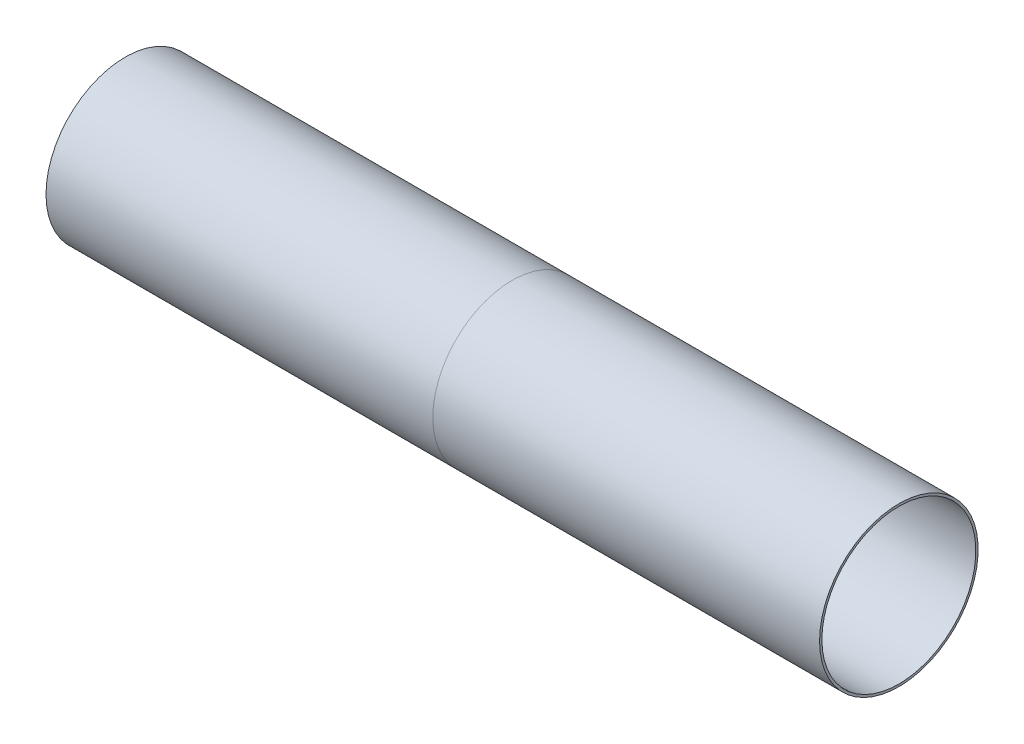
ISO-10303-21;
HEADER;
FILE_DESCRIPTION(('STEP AP214'),'2;1');
FILE_NAME('part.step','',(''),(''),'','','');
FILE_SCHEMA(('AUTOMOTIVE_DESIGN { 1 0 10303 214 1 1 1 1 }'));
ENDSEC;
DATA;
#1=APPLICATION_CONTEXT('core data for automotive mechanical design processes');
#2=APPLICATION_PROTOCOL_DEFINITION('international standard','automotive_design',2000,#1);
#3=PRODUCT_CONTEXT('',#1,'mechanical');
#4=PRODUCT('Part','Part','',(#3));
#5=PRODUCT_RELATED_PRODUCT_CATEGORY('part','',(#4));
#6=PRODUCT_DEFINITION_FORMATION('','',#4);
#7=PRODUCT_DEFINITION_CONTEXT('part definition',#1,'design');
#8=PRODUCT_DEFINITION('design','',#6,#7);
#9=PRODUCT_DEFINITION_SHAPE('','',#8);
#10=(LENGTH_UNIT() NAMED_UNIT(*) SI_UNIT(.MILLI.,.METRE.));
#11=(NAMED_UNIT(*) PLANE_ANGLE_UNIT() SI_UNIT($,.RADIAN.));
#12=(NAMED_UNIT(*) SI_UNIT($,.STERADIAN.) SOLID_ANGLE_UNIT());
#13=UNCERTAINTY_MEASURE_WITH_UNIT(LENGTH_MEASURE(1.E-05),#10,'distance_accuracy_value','');
#14=(GEOMETRIC_REPRESENTATION_CONTEXT(3) GLOBAL_UNCERTAINTY_ASSIGNED_CONTEXT((#13)) GLOBAL_UNIT_ASSIGNED_CONTEXT((#10,
#11,#12)) REPRESENTATION_CONTEXT('',''));
#15=CARTESIAN_POINT('',(0.,0.,0.));
#16=DIRECTION('',(0.,0.,1.));
#17=DIRECTION('',(1.,0.,0.));
#18=AXIS2_PLACEMENT_3D('',#15,#16,#17);
#19=CARTESIAN_POINT('',(-11.4300523027623,0.,-37.6));
#20=DIRECTION('',(1.,0.,0.));
#21=DIRECTION('',(0.,0.,-1.));
#22=AXIS2_PLACEMENT_3D('',#19,#20,#21);
#23=PLANE('',#22);
#24=CARTESIAN_POINT('',(-11.4300523027623,0.,0.));
#25=DIRECTION('',(-1.,0.,0.));
#26=DIRECTION('',(0.,0.,1.));
#27=AXIS2_PLACEMENT_3D('',#24,#25,#26);
#28=CIRCLE('',#27,37.6);
#29=CARTESIAN_POINT('',(-11.4300523027623,0.,37.6));
#30=VERTEX_POINT('',#29);
#31=EDGE_CURVE('E11',#30,#30,#28,.T.);
#32=ORIENTED_EDGE('',*,*,#31,.F.);
#33=EDGE_LOOP('',(#32));
#34=FACE_BOUND('',#33,.T.);
#35=CARTESIAN_POINT('',(-11.4300523027623,0.,0.));
#36=DIRECTION('',(-1.,0.,0.));
#37=DIRECTION('',(0.,0.,1.));
#38=AXIS2_PLACEMENT_3D('',#35,#36,#37);
#39=CIRCLE('',#38,38.8);
#40=CARTESIAN_POINT('',(-11.4300523027623,0.,38.8));
#41=VERTEX_POINT('',#40);
#42=EDGE_CURVE('E69',#41,#41,#39,.T.);
#43=ORIENTED_EDGE('',*,*,#42,.T.);
#44=EDGE_LOOP('',(#43));
#45=FACE_BOUND('',#44,.T.);
#46=ADVANCED_FACE('F50',(#34,#45),#23,.F.);
#47=CARTESIAN_POINT('',(0.,0.,0.));
#48=DIRECTION('',(-1.,0.,0.));
#49=DIRECTION('',(0.,0.,1.));
#50=AXIS2_PLACEMENT_3D('',#47,#48,#49);
#51=CYLINDRICAL_SURFACE('',#50,37.6);
#52=CARTESIAN_POINT('',(11.4300523027623,0.,0.));
#53=DIRECTION('',(-1.,0.,0.));
#54=DIRECTION('',(0.,0.,1.));
#55=AXIS2_PLACEMENT_3D('',#52,#53,#54);
#56=CIRCLE('',#55,37.6);
#57=CARTESIAN_POINT('',(11.4300523027623,0.,37.6));
#58=VERTEX_POINT('',#57);
#59=EDGE_CURVE('E56',#58,#58,#56,.T.);
#60=ORIENTED_EDGE('',*,*,#59,.F.);
#61=EDGE_LOOP('',(#60));
#62=FACE_BOUND('',#61,.T.);
#63=ORIENTED_EDGE('',*,*,#31,.T.);
#64=EDGE_LOOP('',(#63));
#65=FACE_BOUND('',#64,.T.);
#66=ADVANCED_FACE('F88',(#62,#65),#51,.F.);
#67=CARTESIAN_POINT('',(11.4300523027623,0.,-38.8));
#68=DIRECTION('',(-1.,0.,0.));
#69=DIRECTION('',(0.,0.,1.));
#70=AXIS2_PLACEMENT_3D('',#67,#68,#69);
#71=PLANE('',#70);
#72=CARTESIAN_POINT('',(11.4300523027623,0.,0.));
#73=DIRECTION('',(-1.,0.,0.));
#74=DIRECTION('',(0.,0.,1.));
#75=AXIS2_PLACEMENT_3D('',#72,#73,#74);
#76=CIRCLE('',#75,38.8);
#77=CARTESIAN_POINT('',(11.4300523027623,0.,38.8));
#78=VERTEX_POINT('',#77);
#79=EDGE_CURVE('E60',#78,#78,#76,.T.);
#80=ORIENTED_EDGE('',*,*,#79,.F.);
#81=EDGE_LOOP('',(#80));
#82=FACE_BOUND('',#81,.T.);
#83=ORIENTED_EDGE('',*,*,#59,.T.);
#84=EDGE_LOOP('',(#83));
#85=FACE_BOUND('',#84,.T.);
#86=ADVANCED_FACE('F83',(#82,#85),#71,.F.);
#87=CARTESIAN_POINT('',(11.4300523027623,0.,0.));
#88=DIRECTION('',(-1.,0.,0.));
#89=DIRECTION('',(0.,0.,1.));
#90=AXIS2_PLACEMENT_3D('',#87,#88,#89);
#91=CONICAL_SURFACE('',#90,38.8,0.0872664625997096);
#92=CARTESIAN_POINT('',(0.,0.,0.));
#93=DIRECTION('',(-1.,0.,0.));
#94=DIRECTION('',(0.,0.,1.));
#95=AXIS2_PLACEMENT_3D('',#92,#93,#94);
#96=CIRCLE('',#95,39.8);
#97=CARTESIAN_POINT('',(0.,0.,39.8));
#98=VERTEX_POINT('',#97);
#99=EDGE_CURVE('E64',#98,#98,#96,.T.);
#100=ORIENTED_EDGE('',*,*,#99,.F.);
#101=EDGE_LOOP('',(#100));
#102=FACE_BOUND('',#101,.T.);
#103=ORIENTED_EDGE('',*,*,#79,.T.);
#104=EDGE_LOOP('',(#103));
#105=FACE_BOUND('',#104,.T.);
#106=ADVANCED_FACE('F77',(#102,#105),#91,.T.);
#107=CARTESIAN_POINT('',(0.,0.,0.));
#108=DIRECTION('',(1.,0.,0.));
#109=DIRECTION('',(0.,0.,-1.));
#110=AXIS2_PLACEMENT_3D('',#107,#108,#109);
#111=CONICAL_SURFACE('',#110,39.8,0.0872664625997096);
#112=ORIENTED_EDGE('',*,*,#42,.F.);
#113=EDGE_LOOP('',(#112));
#114=FACE_BOUND('',#113,.T.);
#115=ORIENTED_EDGE('',*,*,#99,.T.);
#116=EDGE_LOOP('',(#115));
#117=FACE_BOUND('',#116,.T.);
#118=ADVANCED_FACE('F74',(#114,#117),#111,.T.);
#119=CLOSED_SHELL('',(#46,#66,#86,#106,#118));
#120=MANIFOLD_SOLID_BREP('B2_NOT_SHOWN',#119);
#121=CARTESIAN_POINT('',(0.,0.,0.));
#122=DIRECTION('',(-1.,0.,0.));
#123=DIRECTION('',(0.,0.,1.));
#124=AXIS2_PLACEMENT_3D('',#121,#122,#123);
#125=CYLINDRICAL_SURFACE('',#124,39.8);
#126=CARTESIAN_POINT('',(-12.4300523027623,0.,0.));
#127=DIRECTION('',(-1.,0.,0.));
#128=DIRECTION('',(0.,0.,1.));
#129=AXIS2_PLACEMENT_3D('',#126,#127,#128);
#130=CIRCLE('',#129,39.8);
#131=CARTESIAN_POINT('',(-12.4300523027623,0.,39.8));
#132=VERTEX_POINT('',#131);
#133=EDGE_CURVE('E161',#132,#132,#130,.T.);
#134=ORIENTED_EDGE('',*,*,#133,.F.);
#135=EDGE_LOOP('',(#134));
#136=FACE_BOUND('',#135,.T.);
#137=CARTESIAN_POINT('',(-187.569947697238,0.,0.));
#138=DIRECTION('',(1.,0.,0.));
#139=DIRECTION('',(0.,0.,-1.));
#140=AXIS2_PLACEMENT_3D('',#137,#138,#139);
#141=CIRCLE('',#140,39.8);
#142=CARTESIAN_POINT('',(-187.569947697238,0.,-39.8));
#143=VERTEX_POINT('',#142);
#144=EDGE_CURVE('E49',#143,#143,#141,.T.);
#145=ORIENTED_EDGE('',*,*,#144,.F.);
#146=EDGE_LOOP('',(#145));
#147=FACE_BOUND('',#146,.T.);
#148=ADVANCED_FACE('F144',(#136,#147),#125,.F.);
#149=CARTESIAN_POINT('',(0.,0.,0.));
#150=DIRECTION('',(-1.,0.,0.));
#151=DIRECTION('',(0.,0.,1.));
#152=AXIS2_PLACEMENT_3D('',#149,#150,#151);
#153=CYLINDRICAL_SURFACE('',#152,41.);
#154=CARTESIAN_POINT('',(0.,0.,0.));
#155=DIRECTION('',(-1.,0.,0.));
#156=DIRECTION('',(0.,0.,1.));
#157=AXIS2_PLACEMENT_3D('',#154,#155,#156);
#158=CIRCLE('',#157,41.);
#159=CARTESIAN_POINT('',(0.,0.,41.));
#160=VERTEX_POINT('',#159);
#161=EDGE_CURVE('E170',#160,#160,#158,.T.);
#162=ORIENTED_EDGE('',*,*,#161,.T.);
#163=EDGE_LOOP('',(#162));
#164=FACE_BOUND('',#163,.T.);
#165=CARTESIAN_POINT('',(-200.,0.,0.));
#166=DIRECTION('',(-1.,0.,0.));
#167=DIRECTION('',(0.,0.,1.));
#168=AXIS2_PLACEMENT_3D('',#165,#166,#167);
#169=CIRCLE('',#168,41.);
#170=CARTESIAN_POINT('',(-200.,0.,41.));
#171=VERTEX_POINT('',#170);
#172=EDGE_CURVE('E152',#171,#171,#169,.T.);
#173=ORIENTED_EDGE('',*,*,#172,.F.);
#174=EDGE_LOOP('',(#173));
#175=FACE_BOUND('',#174,.T.);
#176=ADVANCED_FACE('F187',(#164,#175),#153,.T.);
#177=CARTESIAN_POINT('',(-200.,0.,0.));
#178=DIRECTION('',(1.,0.,0.));
#179=DIRECTION('',(0.,0.,-1.));
#180=AXIS2_PLACEMENT_3D('',#177,#178,#179);
#181=PLANE('',#180);
#182=CARTESIAN_POINT('',(-200.,0.,0.));
#183=DIRECTION('',(-1.,0.,0.));
#184=DIRECTION('',(0.,0.,1.));
#185=AXIS2_PLACEMENT_3D('',#182,#183,#184);
#186=CIRCLE('',#185,39.8);
#187=CARTESIAN_POINT('',(-200.,0.,39.8));
#188=VERTEX_POINT('',#187);
#189=EDGE_CURVE('E156',#188,#188,#186,.T.);
#190=ORIENTED_EDGE('',*,*,#189,.F.);
#191=EDGE_LOOP('',(#190));
#192=FACE_BOUND('',#191,.T.);
#193=ORIENTED_EDGE('',*,*,#172,.T.);
#194=EDGE_LOOP('',(#193));
#195=FACE_BOUND('',#194,.T.);
#196=ADVANCED_FACE('F183',(#192,#195),#181,.F.);
#197=CARTESIAN_POINT('',(-11.4300523027623,0.,0.));
#198=DIRECTION('',(-1.,0.,0.));
#199=DIRECTION('',(0.,0.,1.));
#200=AXIS2_PLACEMENT_3D('',#197,#198,#199);
#201=CONICAL_SURFACE('',#200,38.8,0.785398163397444);
#202=ORIENTED_EDGE('',*,*,#133,.T.);
#203=EDGE_LOOP('',(#202));
#204=FACE_BOUND('',#203,.T.);
#205=CARTESIAN_POINT('',(-11.4300523027623,0.,0.));
#206=DIRECTION('',(-1.,0.,0.));
#207=DIRECTION('',(0.,0.,1.));
#208=AXIS2_PLACEMENT_3D('',#205,#206,#207);
#209=CIRCLE('',#208,38.8);
#210=CARTESIAN_POINT('',(-11.4300523027623,0.,38.8));
#211=VERTEX_POINT('',#210);
#212=EDGE_CURVE('E164',#211,#211,#209,.T.);
#213=ORIENTED_EDGE('',*,*,#212,.F.);
#214=EDGE_LOOP('',(#213));
#215=FACE_BOUND('',#214,.T.);
#216=ADVANCED_FACE('F186',(#204,#215),#201,.F.);
#217=CARTESIAN_POINT('',(0.,0.,0.));
#218=DIRECTION('',(1.,0.,0.));
#219=DIRECTION('',(0.,0.,-1.));
#220=AXIS2_PLACEMENT_3D('',#217,#218,#219);
#221=CONICAL_SURFACE('',#220,39.8,0.0872664625997096);
#222=ORIENTED_EDGE('',*,*,#212,.T.);
#223=EDGE_LOOP('',(#222));
#224=FACE_BOUND('',#223,.T.);
#225=CARTESIAN_POINT('',(0.,0.,0.));
#226=DIRECTION('',(-1.,0.,0.));
#227=DIRECTION('',(0.,0.,1.));
#228=AXIS2_PLACEMENT_3D('',#225,#226,#227);
#229=CIRCLE('',#228,39.8);
#230=CARTESIAN_POINT('',(0.,0.,39.8));
#231=VERTEX_POINT('',#230);
#232=EDGE_CURVE('E167',#231,#231,#229,.T.);
#233=ORIENTED_EDGE('',*,*,#232,.F.);
#234=EDGE_LOOP('',(#233));
#235=FACE_BOUND('',#234,.T.);
#236=ADVANCED_FACE('F203',(#224,#235),#221,.F.);
#237=CARTESIAN_POINT('',(0.,0.,0.));
#238=DIRECTION('',(1.,0.,0.));
#239=DIRECTION('',(0.,0.,-1.));
#240=AXIS2_PLACEMENT_3D('',#237,#238,#239);
#241=PLANE('',#240);
#242=ORIENTED_EDGE('',*,*,#232,.T.);
#243=EDGE_LOOP('',(#242));
#244=FACE_BOUND('',#243,.T.);
#245=ORIENTED_EDGE('',*,*,#161,.F.);
#246=EDGE_LOOP('',(#245));
#247=FACE_BOUND('',#246,.T.);
#248=ADVANCED_FACE('F199',(#244,#247),#241,.T.);
#249=CARTESIAN_POINT('',(-188.569947697238,0.,0.));
#250=DIRECTION('',(1.,0.,0.));
#251=DIRECTION('',(0.,0.,-1.));
#252=AXIS2_PLACEMENT_3D('',#249,#250,#251);
#253=CONICAL_SURFACE('',#252,38.8,0.785398163397445);
#254=ORIENTED_EDGE('',*,*,#144,.T.);
#255=EDGE_LOOP('',(#254));
#256=FACE_BOUND('',#255,.T.);
#257=CARTESIAN_POINT('',(-188.569947697238,0.,0.));
#258=DIRECTION('',(-1.,0.,0.));
#259=DIRECTION('',(0.,0.,1.));
#260=AXIS2_PLACEMENT_3D('',#257,#258,#259);
#261=CIRCLE('',#260,38.8);
#262=CARTESIAN_POINT('',(-188.569947697238,0.,38.8));
#263=VERTEX_POINT('',#262);
#264=EDGE_CURVE('E148',#263,#263,#261,.T.);
#265=ORIENTED_EDGE('',*,*,#264,.T.);
#266=EDGE_LOOP('',(#265));
#267=FACE_BOUND('',#266,.T.);
#268=ADVANCED_FACE('F146',(#256,#267),#253,.F.);
#269=CARTESIAN_POINT('',(-200.,0.,0.));
#270=DIRECTION('',(-1.,0.,0.));
#271=DIRECTION('',(0.,0.,1.));
#272=AXIS2_PLACEMENT_3D('',#269,#270,#271);
#273=CONICAL_SURFACE('',#272,39.8,0.08726646259971);
#274=ORIENTED_EDGE('',*,*,#264,.F.);
#275=EDGE_LOOP('',(#274));
#276=FACE_BOUND('',#275,.T.);
#277=ORIENTED_EDGE('',*,*,#189,.T.);
#278=EDGE_LOOP('',(#277));
#279=FACE_BOUND('',#278,.T.);
#280=ADVANCED_FACE('F178',(#276,#279),#273,.F.);
#281=CLOSED_SHELL('',(#148,#176,#196,#216,#236,#248,#268,#280));
#282=MANIFOLD_SOLID_BREP('B6_NOT_SHOWN',#281);
#283=CARTESIAN_POINT('',(0.,0.,0.));
#284=DIRECTION('',(-1.,0.,0.));
#285=DIRECTION('',(0.,0.,1.));
#286=AXIS2_PLACEMENT_3D('',#283,#284,#285);
#287=CONICAL_SURFACE('',#286,39.8,0.0872664625997096);
#288=CARTESIAN_POINT('',(11.4300523027623,0.,0.));
#289=DIRECTION('',(-1.,0.,0.));
#290=DIRECTION('',(0.,0.,1.));
#291=AXIS2_PLACEMENT_3D('',#288,#289,#290);
#292=CIRCLE('',#291,38.8);
#293=CARTESIAN_POINT('',(11.4300523027623,0.,38.8));
#294=VERTEX_POINT('',#293);
#295=EDGE_CURVE('E143',#294,#294,#292,.T.);
#296=ORIENTED_EDGE('',*,*,#295,.F.);
#297=EDGE_LOOP('',(#296));
#298=FACE_BOUND('',#297,.T.);
#299=CARTESIAN_POINT('',(0.,0.,0.));
#300=DIRECTION('',(-1.,0.,0.));
#301=DIRECTION('',(0.,0.,1.));
#302=AXIS2_PLACEMENT_3D('',#299,#300,#301);
#303=CIRCLE('',#302,39.8);
#304=CARTESIAN_POINT('',(0.,0.,39.8));
#305=VERTEX_POINT('',#304);
#306=EDGE_CURVE('E310',#305,#305,#303,.T.);
#307=ORIENTED_EDGE('',*,*,#306,.T.);
#308=EDGE_LOOP('',(#307));
#309=FACE_BOUND('',#308,.T.);
#310=ADVANCED_FACE('F288',(#298,#309),#287,.F.);
#311=CARTESIAN_POINT('',(11.4300523027623,0.,0.));
#312=DIRECTION('',(1.,0.,0.));
#313=DIRECTION('',(0.,0.,-1.));
#314=AXIS2_PLACEMENT_3D('',#311,#312,#313);
#315=CONICAL_SURFACE('',#314,38.8,0.785398163397442);
#316=CARTESIAN_POINT('',(12.4300523027623,0.,0.));
#317=DIRECTION('',(-1.,0.,0.));
#318=DIRECTION('',(0.,0.,1.));
#319=AXIS2_PLACEMENT_3D('',#316,#317,#318);
#320=CIRCLE('',#319,39.8);
#321=CARTESIAN_POINT('',(12.4300523027623,0.,39.8));
#322=VERTEX_POINT('',#321);
#323=EDGE_CURVE('E294',#322,#322,#320,.T.);
#324=ORIENTED_EDGE('',*,*,#323,.F.);
#325=EDGE_LOOP('',(#324));
#326=FACE_BOUND('',#325,.T.);
#327=ORIENTED_EDGE('',*,*,#295,.T.);
#328=EDGE_LOOP('',(#327));
#329=FACE_BOUND('',#328,.T.);
#330=ADVANCED_FACE('F335',(#326,#329),#315,.F.);
#331=CARTESIAN_POINT('',(0.,0.,0.));
#332=DIRECTION('',(-1.,0.,0.));
#333=DIRECTION('',(0.,0.,1.));
#334=AXIS2_PLACEMENT_3D('',#331,#332,#333);
#335=CYLINDRICAL_SURFACE('',#334,39.8);
#336=ORIENTED_EDGE('',*,*,#323,.T.);
#337=EDGE_LOOP('',(#336));
#338=FACE_BOUND('',#337,.T.);
#339=CARTESIAN_POINT('',(200.,0.,0.));
#340=DIRECTION('',(-1.,0.,0.));
#341=DIRECTION('',(0.,0.,1.));
#342=AXIS2_PLACEMENT_3D('',#339,#340,#341);
#343=CIRCLE('',#342,39.8);
#344=CARTESIAN_POINT('',(200.,0.,39.8));
#345=VERTEX_POINT('',#344);
#346=EDGE_CURVE('E298',#345,#345,#343,.T.);
#347=ORIENTED_EDGE('',*,*,#346,.F.);
#348=EDGE_LOOP('',(#347));
#349=FACE_BOUND('',#348,.T.);
#350=ADVANCED_FACE('F329',(#338,#349),#335,.F.);
#351=CARTESIAN_POINT('',(200.,0.,0.));
#352=DIRECTION('',(1.,0.,0.));
#353=DIRECTION('',(0.,0.,-1.));
#354=AXIS2_PLACEMENT_3D('',#351,#352,#353);
#355=PLANE('',#354);
#356=ORIENTED_EDGE('',*,*,#346,.T.);
#357=EDGE_LOOP('',(#356));
#358=FACE_BOUND('',#357,.T.);
#359=CARTESIAN_POINT('',(200.,0.,0.));
#360=DIRECTION('',(-1.,0.,0.));
#361=DIRECTION('',(0.,0.,1.));
#362=AXIS2_PLACEMENT_3D('',#359,#360,#361);
#363=CIRCLE('',#362,41.);
#364=CARTESIAN_POINT('',(200.,0.,41.));
#365=VERTEX_POINT('',#364);
#366=EDGE_CURVE('E302',#365,#365,#363,.T.);
#367=ORIENTED_EDGE('',*,*,#366,.F.);
#368=EDGE_LOOP('',(#367));
#369=FACE_BOUND('',#368,.T.);
#370=ADVANCED_FACE('F324',(#358,#369),#355,.T.);
#371=CARTESIAN_POINT('',(0.,0.,0.));
#372=DIRECTION('',(-1.,0.,0.));
#373=DIRECTION('',(0.,0.,1.));
#374=AXIS2_PLACEMENT_3D('',#371,#372,#373);
#375=CYLINDRICAL_SURFACE('',#374,41.);
#376=CARTESIAN_POINT('',(0.,0.,0.));
#377=DIRECTION('',(-1.,0.,0.));
#378=DIRECTION('',(0.,0.,1.));
#379=AXIS2_PLACEMENT_3D('',#376,#377,#378);
#380=CIRCLE('',#379,41.);
#381=CARTESIAN_POINT('',(0.,0.,41.));
#382=VERTEX_POINT('',#381);
#383=EDGE_CURVE('E307',#382,#382,#380,.T.);
#384=ORIENTED_EDGE('',*,*,#383,.F.);
#385=EDGE_LOOP('',(#384));
#386=FACE_BOUND('',#385,.T.);
#387=ORIENTED_EDGE('',*,*,#366,.T.);
#388=EDGE_LOOP('',(#387));
#389=FACE_BOUND('',#388,.T.);
#390=ADVANCED_FACE('F318',(#386,#389),#375,.T.);
#391=CARTESIAN_POINT('',(0.,0.,0.));
#392=DIRECTION('',(1.,0.,0.));
#393=DIRECTION('',(0.,0.,-1.));
#394=AXIS2_PLACEMENT_3D('',#391,#392,#393);
#395=PLANE('',#394);
#396=ORIENTED_EDGE('',*,*,#306,.F.);
#397=EDGE_LOOP('',(#396));
#398=FACE_BOUND('',#397,.T.);
#399=ORIENTED_EDGE('',*,*,#383,.T.);
#400=EDGE_LOOP('',(#399));
#401=FACE_BOUND('',#400,.T.);
#402=ADVANCED_FACE('F315',(#398,#401),#395,.F.);
#403=CLOSED_SHELL('',(#310,#330,#350,#370,#390,#402));
#404=MANIFOLD_SOLID_BREP('B44',#403);
#405=ADVANCED_BREP_SHAPE_REPRESENTATION('',(#18,#120,#282,#404),#14);
#406=SHAPE_DEFINITION_REPRESENTATION(#9,#405);
ENDSEC;
END-ISO-10303-21;
